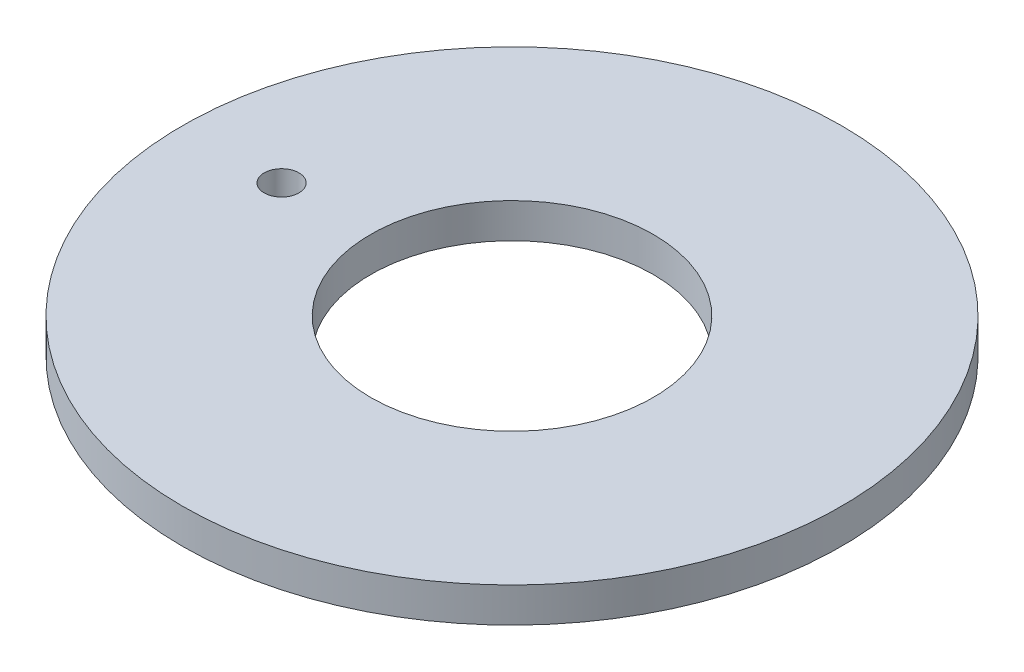
ISO-10303-21;
HEADER;
FILE_DESCRIPTION(('STEP AP214'),'2;1');
FILE_NAME('part.step','',(''),(''),'','','');
FILE_SCHEMA(('AUTOMOTIVE_DESIGN { 1 0 10303 214 1 1 1 1 }'));
ENDSEC;
DATA;
#1=APPLICATION_CONTEXT('core data for automotive mechanical design processes');
#2=APPLICATION_PROTOCOL_DEFINITION('international standard','automotive_design',2000,#1);
#3=PRODUCT_CONTEXT('',#1,'mechanical');
#4=PRODUCT('Part','Part','',(#3));
#5=PRODUCT_RELATED_PRODUCT_CATEGORY('part','',(#4));
#6=PRODUCT_DEFINITION_FORMATION('','',#4);
#7=PRODUCT_DEFINITION_CONTEXT('part definition',#1,'design');
#8=PRODUCT_DEFINITION('design','',#6,#7);
#9=PRODUCT_DEFINITION_SHAPE('','',#8);
#10=(LENGTH_UNIT() NAMED_UNIT(*) SI_UNIT(.MILLI.,.METRE.));
#11=(NAMED_UNIT(*) PLANE_ANGLE_UNIT() SI_UNIT($,.RADIAN.));
#12=(NAMED_UNIT(*) SI_UNIT($,.STERADIAN.) SOLID_ANGLE_UNIT());
#13=UNCERTAINTY_MEASURE_WITH_UNIT(LENGTH_MEASURE(1.E-05),#10,'distance_accuracy_value','');
#14=(GEOMETRIC_REPRESENTATION_CONTEXT(3) GLOBAL_UNCERTAINTY_ASSIGNED_CONTEXT((#13)) GLOBAL_UNIT_ASSIGNED_CONTEXT((#10,
#11,#12)) REPRESENTATION_CONTEXT('',''));
#15=CARTESIAN_POINT('',(0.,0.,0.));
#16=DIRECTION('',(0.,0.,1.));
#17=DIRECTION('',(1.,0.,0.));
#18=AXIS2_PLACEMENT_3D('',#15,#16,#17);
#19=CARTESIAN_POINT('',(0.,4.,0.));
#20=DIRECTION('',(0.,1.,0.));
#21=DIRECTION('',(0.,0.,1.));
#22=AXIS2_PLACEMENT_3D('',#19,#20,#21);
#23=PLANE('',#22);
#24=CARTESIAN_POINT('',(-26.5,4.,0.));
#25=DIRECTION('',(0.,1.,0.));
#26=DIRECTION('',(0.,0.,1.));
#27=AXIS2_PLACEMENT_3D('',#24,#25,#26);
#28=CIRCLE('',#27,2.);
#29=CARTESIAN_POINT('',(-26.5,4.,2.));
#30=VERTEX_POINT('',#29);
#31=EDGE_CURVE('E52',#30,#30,#28,.T.);
#32=ORIENTED_EDGE('',*,*,#31,.F.);
#33=EDGE_LOOP('',(#32));
#34=FACE_BOUND('',#33,.T.);
#35=CARTESIAN_POINT('',(0.,4.,0.));
#36=DIRECTION('',(0.,1.,0.));
#37=DIRECTION('',(0.,0.,1.));
#38=AXIS2_PLACEMENT_3D('',#35,#36,#37);
#39=CIRCLE('',#38,37.9);
#40=CARTESIAN_POINT('',(0.,4.,37.9));
#41=VERTEX_POINT('',#40);
#42=EDGE_CURVE('E10',#41,#41,#39,.T.);
#43=ORIENTED_EDGE('',*,*,#42,.T.);
#44=EDGE_LOOP('',(#43));
#45=FACE_BOUND('',#44,.T.);
#46=CARTESIAN_POINT('',(0.,4.,0.));
#47=DIRECTION('',(0.,1.,0.));
#48=DIRECTION('',(0.,0.,1.));
#49=AXIS2_PLACEMENT_3D('',#46,#47,#48);
#50=CIRCLE('',#49,16.25);
#51=CARTESIAN_POINT('',(0.,4.,16.25));
#52=VERTEX_POINT('',#51);
#53=EDGE_CURVE('E44',#52,#52,#50,.T.);
#54=ORIENTED_EDGE('',*,*,#53,.F.);
#55=EDGE_LOOP('',(#54));
#56=FACE_BOUND('',#55,.T.);
#57=ADVANCED_FACE('F33',(#34,#45,#56),#23,.T.);
#58=CARTESIAN_POINT('',(0.,0.,0.));
#59=DIRECTION('',(0.,1.,0.));
#60=DIRECTION('',(0.,0.,1.));
#61=AXIS2_PLACEMENT_3D('',#58,#59,#60);
#62=PLANE('',#61);
#63=CARTESIAN_POINT('',(-26.5,0.,0.));
#64=DIRECTION('',(0.,1.,0.));
#65=DIRECTION('',(0.,0.,1.));
#66=AXIS2_PLACEMENT_3D('',#63,#64,#65);
#67=CIRCLE('',#66,2.);
#68=CARTESIAN_POINT('',(-26.5,0.,2.));
#69=VERTEX_POINT('',#68);
#70=EDGE_CURVE('E49',#69,#69,#67,.T.);
#71=ORIENTED_EDGE('',*,*,#70,.T.);
#72=EDGE_LOOP('',(#71));
#73=FACE_BOUND('',#72,.T.);
#74=CARTESIAN_POINT('',(0.,0.,0.));
#75=DIRECTION('',(0.,1.,0.));
#76=DIRECTION('',(0.,0.,1.));
#77=AXIS2_PLACEMENT_3D('',#74,#75,#76);
#78=CIRCLE('',#77,37.9);
#79=CARTESIAN_POINT('',(0.,0.,37.9));
#80=VERTEX_POINT('',#79);
#81=EDGE_CURVE('E37',#80,#80,#78,.T.);
#82=ORIENTED_EDGE('',*,*,#81,.F.);
#83=EDGE_LOOP('',(#82));
#84=FACE_BOUND('',#83,.T.);
#85=CARTESIAN_POINT('',(0.,0.,0.));
#86=DIRECTION('',(0.,1.,0.));
#87=DIRECTION('',(0.,0.,1.));
#88=AXIS2_PLACEMENT_3D('',#85,#86,#87);
#89=CIRCLE('',#88,16.25);
#90=CARTESIAN_POINT('',(0.,0.,16.25));
#91=VERTEX_POINT('',#90);
#92=EDGE_CURVE('E46',#91,#91,#89,.T.);
#93=ORIENTED_EDGE('',*,*,#92,.T.);
#94=EDGE_LOOP('',(#93));
#95=FACE_BOUND('',#94,.T.);
#96=ADVANCED_FACE('F58',(#73,#84,#95),#62,.F.);
#97=CARTESIAN_POINT('',(0.,4.,0.));
#98=DIRECTION('',(0.,-1.,0.));
#99=DIRECTION('',(0.,0.,-1.));
#100=AXIS2_PLACEMENT_3D('',#97,#98,#99);
#101=CYLINDRICAL_SURFACE('',#100,37.9);
#102=ORIENTED_EDGE('',*,*,#42,.F.);
#103=EDGE_LOOP('',(#102));
#104=FACE_BOUND('',#103,.T.);
#105=ORIENTED_EDGE('',*,*,#81,.T.);
#106=EDGE_LOOP('',(#105));
#107=FACE_BOUND('',#106,.T.);
#108=ADVANCED_FACE('F35',(#104,#107),#101,.T.);
#109=CARTESIAN_POINT('',(0.,4.,0.));
#110=DIRECTION('',(0.,-1.,0.));
#111=DIRECTION('',(0.,0.,-1.));
#112=AXIS2_PLACEMENT_3D('',#109,#110,#111);
#113=CYLINDRICAL_SURFACE('',#112,16.25);
#114=ORIENTED_EDGE('',*,*,#53,.T.);
#115=EDGE_LOOP('',(#114));
#116=FACE_BOUND('',#115,.T.);
#117=ORIENTED_EDGE('',*,*,#92,.F.);
#118=EDGE_LOOP('',(#117));
#119=FACE_BOUND('',#118,.T.);
#120=ADVANCED_FACE('F64',(#116,#119),#113,.F.);
#121=CARTESIAN_POINT('',(-26.5,0.,0.));
#122=DIRECTION('',(0.,1.,0.));
#123=DIRECTION('',(0.,0.,1.));
#124=AXIS2_PLACEMENT_3D('',#121,#122,#123);
#125=CYLINDRICAL_SURFACE('',#124,2.);
#126=ORIENTED_EDGE('',*,*,#70,.F.);
#127=EDGE_LOOP('',(#126));
#128=FACE_BOUND('',#127,.T.);
#129=ORIENTED_EDGE('',*,*,#31,.T.);
#130=EDGE_LOOP('',(#129));
#131=FACE_BOUND('',#130,.T.);
#132=ADVANCED_FACE('F61',(#128,#131),#125,.F.);
#133=CLOSED_SHELL('',(#57,#96,#108,#120,#132));
#134=MANIFOLD_SOLID_BREP('B2',#133);
#135=ADVANCED_BREP_SHAPE_REPRESENTATION('',(#18,#134),#14);
#136=SHAPE_DEFINITION_REPRESENTATION(#9,#135);
ENDSEC;
END-ISO-10303-21;
